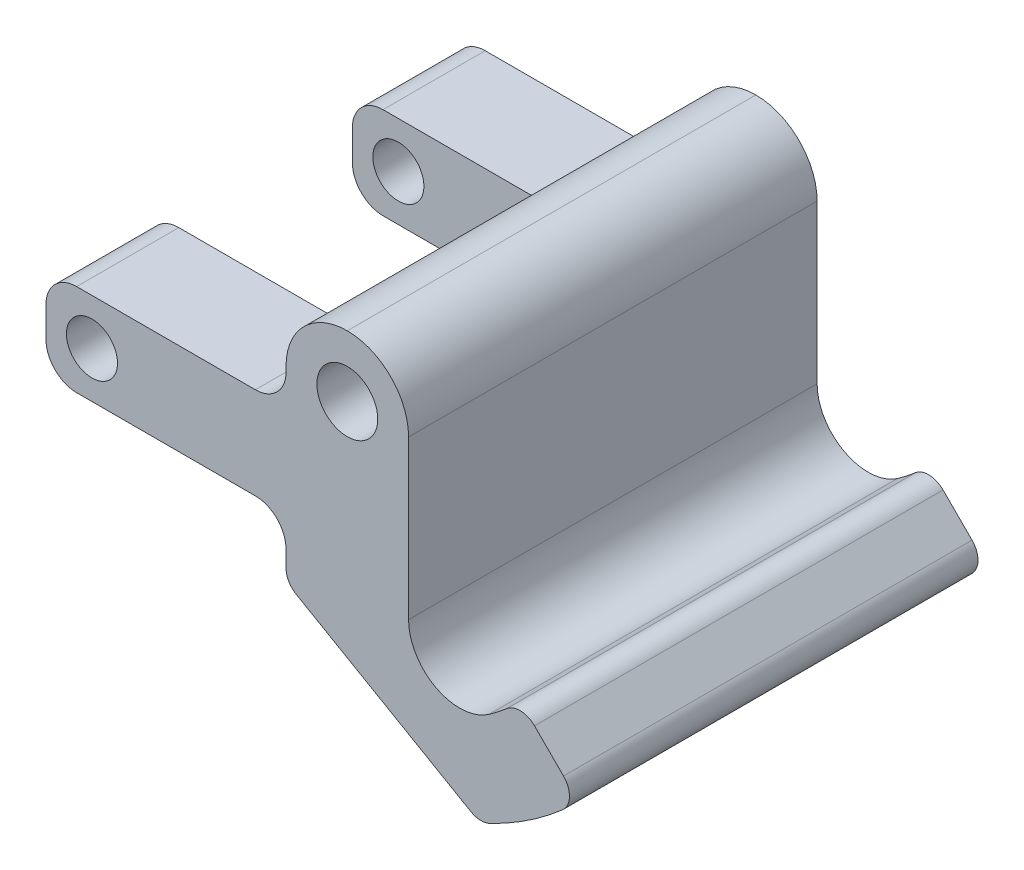
ISO-10303-21;
HEADER;
FILE_DESCRIPTION(('STEP AP214'),'2;1');
FILE_NAME('part.step','',(''),(''),'','','');
FILE_SCHEMA(('AUTOMOTIVE_DESIGN { 1 0 10303 214 1 1 1 1 }'));
ENDSEC;
DATA;
#1=APPLICATION_CONTEXT('core data for automotive mechanical design processes');
#2=APPLICATION_PROTOCOL_DEFINITION('international standard','automotive_design',2000,#1);
#3=PRODUCT_CONTEXT('',#1,'mechanical');
#4=PRODUCT('Part','Part','',(#3));
#5=PRODUCT_RELATED_PRODUCT_CATEGORY('part','',(#4));
#6=PRODUCT_DEFINITION_FORMATION('','',#4);
#7=PRODUCT_DEFINITION_CONTEXT('part definition',#1,'design');
#8=PRODUCT_DEFINITION('design','',#6,#7);
#9=PRODUCT_DEFINITION_SHAPE('','',#8);
#10=(LENGTH_UNIT() NAMED_UNIT(*) SI_UNIT(.MILLI.,.METRE.));
#11=(NAMED_UNIT(*) PLANE_ANGLE_UNIT() SI_UNIT($,.RADIAN.));
#12=(NAMED_UNIT(*) SI_UNIT($,.STERADIAN.) SOLID_ANGLE_UNIT());
#13=UNCERTAINTY_MEASURE_WITH_UNIT(LENGTH_MEASURE(1.E-05),#10,'distance_accuracy_value','');
#14=(GEOMETRIC_REPRESENTATION_CONTEXT(3) GLOBAL_UNCERTAINTY_ASSIGNED_CONTEXT((#13)) GLOBAL_UNIT_ASSIGNED_CONTEXT((#10,
#11,#12)) REPRESENTATION_CONTEXT('',''));
#15=CARTESIAN_POINT('',(0.,0.,0.));
#16=DIRECTION('',(0.,0.,1.));
#17=DIRECTION('',(1.,0.,0.));
#18=AXIS2_PLACEMENT_3D('',#15,#16,#17);
#19=CARTESIAN_POINT('',(-6.,6.,20.));
#20=DIRECTION('',(1.,0.,0.));
#21=DIRECTION('',(0.,1.,0.));
#22=AXIS2_PLACEMENT_3D('',#19,#20,#21);
#23=PLANE('',#22);
#24=DIRECTION('',(0.,1.,0.));
#25=VECTOR('',#24,1.);
#26=CARTESIAN_POINT('',(-6.,-12.5,-10.));
#27=LINE('',#26,#25);
#28=CARTESIAN_POINT('',(-6.,-15.5,-10.));
#29=VERTEX_POINT('',#28);
#30=CARTESIAN_POINT('',(-6.,-0.500000000000002,-10.));
#31=VERTEX_POINT('',#30);
#32=EDGE_CURVE('E397',#29,#31,#27,.T.);
#33=ORIENTED_EDGE('',*,*,#32,.F.);
#34=DIRECTION('',(0.,0.,-1.));
#35=VECTOR('',#34,1.);
#36=CARTESIAN_POINT('',(-6.,-15.5,-20.));
#37=LINE('',#36,#35);
#38=CARTESIAN_POINT('',(-6.,-15.5,-20.));
#39=VERTEX_POINT('',#38);
#40=EDGE_CURVE('E364',#29,#39,#37,.T.);
#41=ORIENTED_EDGE('',*,*,#40,.T.);
#42=DIRECTION('',(0.,-1.,0.));
#43=VECTOR('',#42,1.);
#44=CARTESIAN_POINT('',(-6.,6.,-20.));
#45=LINE('',#44,#43);
#46=CARTESIAN_POINT('',(-6.,-17.1160273814448,-20.));
#47=VERTEX_POINT('',#46);
#48=EDGE_CURVE('E254',#39,#47,#45,.T.);
#49=ORIENTED_EDGE('',*,*,#48,.T.);
#50=DIRECTION('',(0.,0.,-1.));
#51=VECTOR('',#50,1.);
#52=CARTESIAN_POINT('',(-6.,-17.1160273814448,20.));
#53=LINE('',#52,#51);
#54=CARTESIAN_POINT('',(-6.,-17.1160273814448,20.));
#55=VERTEX_POINT('',#54);
#56=EDGE_CURVE('E292',#47,#55,#53,.F.);
#57=ORIENTED_EDGE('',*,*,#56,.T.);
#58=DIRECTION('',(0.,-1.,0.));
#59=VECTOR('',#58,1.);
#60=CARTESIAN_POINT('',(-6.,6.,20.));
#61=LINE('',#60,#59);
#62=CARTESIAN_POINT('',(-6.,-15.5,20.));
#63=VERTEX_POINT('',#62);
#64=EDGE_CURVE('E424',#63,#55,#61,.T.);
#65=ORIENTED_EDGE('',*,*,#64,.F.);
#66=DIRECTION('',(0.,0.,1.));
#67=VECTOR('',#66,1.);
#68=CARTESIAN_POINT('',(-6.,-15.5,20.));
#69=LINE('',#68,#67);
#70=CARTESIAN_POINT('',(-6.,-15.5,10.));
#71=VERTEX_POINT('',#70);
#72=EDGE_CURVE('E332',#63,#71,#69,.F.);
#73=ORIENTED_EDGE('',*,*,#72,.T.);
#74=DIRECTION('',(0.,1.,0.));
#75=VECTOR('',#74,1.);
#76=CARTESIAN_POINT('',(-6.,-12.5,10.));
#77=LINE('',#76,#75);
#78=CARTESIAN_POINT('',(-6.,-0.500000000000002,10.));
#79=VERTEX_POINT('',#78);
#80=EDGE_CURVE('E476',#71,#79,#77,.T.);
#81=ORIENTED_EDGE('',*,*,#80,.T.);
#82=DIRECTION('',(0.,0.,1.));
#83=VECTOR('',#82,1.);
#84=CARTESIAN_POINT('',(-6.,-0.500000000000002,20.));
#85=LINE('',#84,#83);
#86=CARTESIAN_POINT('',(-6.,-0.500000000000002,20.));
#87=VERTEX_POINT('',#86);
#88=EDGE_CURVE('E330',#79,#87,#85,.T.);
#89=ORIENTED_EDGE('',*,*,#88,.T.);
#90=CARTESIAN_POINT('',(-6.,0.,20.));
#91=VERTEX_POINT('',#90);
#92=EDGE_CURVE('E238',#91,#87,#61,.T.);
#93=ORIENTED_EDGE('',*,*,#92,.F.);
#94=DIRECTION('',(0.,0.,-1.));
#95=VECTOR('',#94,1.);
#96=CARTESIAN_POINT('',(-6.,0.,20.));
#97=LINE('',#96,#95);
#98=CARTESIAN_POINT('',(-6.,0.,-20.));
#99=VERTEX_POINT('',#98);
#100=EDGE_CURVE('E231',#91,#99,#97,.T.);
#101=ORIENTED_EDGE('',*,*,#100,.T.);
#102=CARTESIAN_POINT('',(-6.,-0.500000000000002,-20.));
#103=VERTEX_POINT('',#102);
#104=EDGE_CURVE('E234',#99,#103,#45,.T.);
#105=ORIENTED_EDGE('',*,*,#104,.T.);
#106=DIRECTION('',(0.,0.,-1.));
#107=VECTOR('',#106,1.);
#108=CARTESIAN_POINT('',(-6.,-0.500000000000002,-10.));
#109=LINE('',#108,#107);
#110=EDGE_CURVE('E362',#103,#31,#109,.F.);
#111=ORIENTED_EDGE('',*,*,#110,.T.);
#112=EDGE_LOOP('',(#33,#41,#49,#57,#65,#73,#81,#89,#93,#101,#105,#111));
#113=FACE_BOUND('',#112,.T.);
#114=ADVANCED_FACE('F38',(#113),#23,.F.);
#115=CARTESIAN_POINT('',(0.,0.,20.));
#116=DIRECTION('',(0.,0.,1.));
#117=DIRECTION('',(1.,0.,0.));
#118=AXIS2_PLACEMENT_3D('',#115,#116,#117);
#119=PLANE('',#118);
#120=DIRECTION('',(0.,-1.,0.));
#121=VECTOR('',#120,1.);
#122=CARTESIAN_POINT('',(-29.5,-3.50000000000001,20.));
#123=LINE('',#122,#121);
#124=CARTESIAN_POINT('',(-29.5,-6.50000000000001,20.));
#125=VERTEX_POINT('',#124);
#126=CARTESIAN_POINT('',(-29.5,-9.50000000000001,20.));
#127=VERTEX_POINT('',#126);
#128=EDGE_CURVE('E468',#125,#127,#123,.T.);
#129=ORIENTED_EDGE('',*,*,#128,.T.);
#130=CARTESIAN_POINT('',(-26.5,-9.50000000000001,20.));
#131=DIRECTION('',(0.,0.,1.));
#132=DIRECTION('',(1.,0.,0.));
#133=AXIS2_PLACEMENT_3D('',#130,#131,#132);
#134=CIRCLE('',#133,3.);
#135=CARTESIAN_POINT('',(-26.5,-12.5,20.));
#136=VERTEX_POINT('',#135);
#137=EDGE_CURVE('E347',#127,#136,#134,.T.);
#138=ORIENTED_EDGE('',*,*,#137,.T.);
#139=DIRECTION('',(1.,0.,0.));
#140=VECTOR('',#139,1.);
#141=CARTESIAN_POINT('',(-29.5,-12.5,20.));
#142=LINE('',#141,#140);
#143=CARTESIAN_POINT('',(-9.00000000000001,-12.5,20.));
#144=VERTEX_POINT('',#143);
#145=EDGE_CURVE('E484',#136,#144,#142,.T.);
#146=ORIENTED_EDGE('',*,*,#145,.T.);
#147=CARTESIAN_POINT('',(-9.00000000000001,-15.5,20.));
#148=DIRECTION('',(0.,0.,1.));
#149=DIRECTION('',(1.,0.,0.));
#150=AXIS2_PLACEMENT_3D('',#147,#148,#149);
#151=CIRCLE('',#150,3.);
#152=EDGE_CURVE('E353',#144,#63,#151,.F.);
#153=ORIENTED_EDGE('',*,*,#152,.T.);
#154=ORIENTED_EDGE('',*,*,#64,.T.);
#155=CARTESIAN_POINT('',(-4.,-17.1160273814448,20.));
#156=DIRECTION('',(0.,0.,1.));
#157=DIRECTION('',(1.,0.,0.));
#158=AXIS2_PLACEMENT_3D('',#155,#156,#157);
#159=CIRCLE('',#158,2.);
#160=CARTESIAN_POINT('',(-5.,-18.8480781890137,20.));
#161=VERTEX_POINT('',#160);
#162=EDGE_CURVE('E301',#55,#161,#159,.T.);
#163=ORIENTED_EDGE('',*,*,#162,.T.);
#164=DIRECTION('',(0.86602540378444,-0.499999999999998,0.));
#165=VECTOR('',#164,1.);
#166=CARTESIAN_POINT('',(-6.,-18.2707279198241,20.));
#167=LINE('',#166,#165);
#168=CARTESIAN_POINT('',(12.0999852786396,-28.7207592927748,20.));
#169=VERTEX_POINT('',#168);
#170=EDGE_CURVE('E430',#161,#169,#167,.T.);
#171=ORIENTED_EDGE('',*,*,#170,.T.);
#172=CARTESIAN_POINT('',(13.0999852786395,-26.9887084852059,20.));
#173=DIRECTION('',(0.,0.,1.));
#174=DIRECTION('',(1.,0.,0.));
#175=AXIS2_PLACEMENT_3D('',#172,#173,#174);
#176=CIRCLE('',#175,2.);
#177=CARTESIAN_POINT('',(13.9733176305489,-28.787955717553,20.));
#178=VERTEX_POINT('',#177);
#179=EDGE_CURVE('E299',#169,#178,#176,.T.);
#180=ORIENTED_EDGE('',*,*,#179,.T.);
#181=CARTESIAN_POINT('',(0.,0.,20.));
#182=DIRECTION('',(0.,0.,1.));
#183=DIRECTION('',(1.,0.,0.));
#184=AXIS2_PLACEMENT_3D('',#181,#182,#183);
#185=CIRCLE('',#184,32.);
#186=CARTESIAN_POINT('',(21.0685833878864,-24.0855723209493,20.));
#187=VERTEX_POINT('',#186);
#188=EDGE_CURVE('E435',#178,#187,#185,.T.);
#189=ORIENTED_EDGE('',*,*,#188,.T.);
#190=CARTESIAN_POINT('',(19.7517969261435,-22.5802240508899,20.));
#191=DIRECTION('',(0.,0.,1.));
#192=DIRECTION('',(1.,0.,0.));
#193=AXIS2_PLACEMENT_3D('',#190,#191,#192);
#194=CIRCLE('',#193,2.);
#195=CARTESIAN_POINT('',(21.1660104885166,-21.1660104885168,20.));
#196=VERTEX_POINT('',#195);
#197=EDGE_CURVE('E297',#187,#196,#194,.T.);
#198=ORIENTED_EDGE('',*,*,#197,.T.);
#199=DIRECTION('',(-0.707106781186544,0.707106781186551,0.));
#200=VECTOR('',#199,1.);
#201=CARTESIAN_POINT('',(16.9705627484771,-16.9705627484772,20.));
#202=LINE('',#201,#200);
#203=CARTESIAN_POINT('',(18.3303027798233,-18.3303027798235,20.));
#204=VERTEX_POINT('',#203);
#205=EDGE_CURVE('E438',#196,#204,#202,.T.);
#206=ORIENTED_EDGE('',*,*,#205,.T.);
#207=CARTESIAN_POINT('',(16.9160892174502,-19.7445163421965,20.));
#208=DIRECTION('',(0.,0.,1.));
#209=DIRECTION('',(1.,0.,0.));
#210=AXIS2_PLACEMENT_3D('',#207,#208,#209);
#211=CIRCLE('',#210,2.);
#212=CARTESIAN_POINT('',(15.6148515853386,-18.2257073927968,20.));
#213=VERTEX_POINT('',#212);
#214=EDGE_CURVE('E295',#204,#213,#211,.T.);
#215=ORIENTED_EDGE('',*,*,#214,.T.);
#216=CARTESIAN_POINT('',(0.,0.,20.));
#217=DIRECTION('',(0.,0.,-1.));
#218=DIRECTION('',(1.,0.,0.));
#219=AXIS2_PLACEMENT_3D('',#216,#217,#218);
#220=CIRCLE('',#219,24.);
#221=CARTESIAN_POINT('',(13.8947368421053,-19.5687579597848,20.));
#222=VERTEX_POINT('',#221);
#223=EDGE_CURVE('E265',#213,#222,#220,.T.);
#224=ORIENTED_EDGE('',*,*,#223,.T.);
#225=CARTESIAN_POINT('',(11.,-15.4919333848297,20.));
#226=DIRECTION('',(0.,0.,1.));
#227=DIRECTION('',(1.,0.,0.));
#228=AXIS2_PLACEMENT_3D('',#225,#226,#227);
#229=CIRCLE('',#228,5.);
#230=CARTESIAN_POINT('',(6.,-15.4919333848297,20.));
#231=VERTEX_POINT('',#230);
#232=EDGE_CURVE('E323',#222,#231,#229,.F.);
#233=ORIENTED_EDGE('',*,*,#232,.T.);
#234=DIRECTION('',(0.,1.,0.));
#235=VECTOR('',#234,1.);
#236=CARTESIAN_POINT('',(6.,6.,20.));
#237=LINE('',#236,#235);
#238=CARTESIAN_POINT('',(6.,0.,20.));
#239=VERTEX_POINT('',#238);
#240=EDGE_CURVE('E261',#231,#239,#237,.T.);
#241=ORIENTED_EDGE('',*,*,#240,.T.);
#242=CARTESIAN_POINT('',(0.,0.,20.));
#243=DIRECTION('',(0.,0.,1.));
#244=DIRECTION('',(1.,0.,0.));
#245=AXIS2_PLACEMENT_3D('',#242,#243,#244);
#246=CIRCLE('',#245,6.);
#247=CARTESIAN_POINT('',(0.,6.,20.));
#248=VERTEX_POINT('',#247);
#249=EDGE_CURVE('E243',#239,#248,#246,.T.);
#250=ORIENTED_EDGE('',*,*,#249,.T.);
#251=CARTESIAN_POINT('',(0.,0.,20.));
#252=DIRECTION('',(0.,0.,1.));
#253=DIRECTION('',(1.,0.,0.));
#254=AXIS2_PLACEMENT_3D('',#251,#252,#253);
#255=CIRCLE('',#254,6.);
#256=EDGE_CURVE('E273',#248,#91,#255,.T.);
#257=ORIENTED_EDGE('',*,*,#256,.T.);
#258=ORIENTED_EDGE('',*,*,#92,.T.);
#259=CARTESIAN_POINT('',(-9.,-0.500000000000002,20.));
#260=DIRECTION('',(0.,0.,1.));
#261=DIRECTION('',(1.,0.,0.));
#262=AXIS2_PLACEMENT_3D('',#259,#260,#261);
#263=CIRCLE('',#262,3.);
#264=CARTESIAN_POINT('',(-9.,-3.5,20.));
#265=VERTEX_POINT('',#264);
#266=EDGE_CURVE('E357',#87,#265,#263,.F.);
#267=ORIENTED_EDGE('',*,*,#266,.T.);
#268=DIRECTION('',(-1.,0.,0.));
#269=VECTOR('',#268,1.);
#270=CARTESIAN_POINT('',(-6.,-3.5,20.));
#271=LINE('',#270,#269);
#272=CARTESIAN_POINT('',(-26.5,-3.50000000000001,20.));
#273=VERTEX_POINT('',#272);
#274=EDGE_CURVE('E459',#265,#273,#271,.T.);
#275=ORIENTED_EDGE('',*,*,#274,.T.);
#276=CARTESIAN_POINT('',(-26.5,-6.50000000000001,20.));
#277=DIRECTION('',(0.,0.,1.));
#278=DIRECTION('',(1.,0.,0.));
#279=AXIS2_PLACEMENT_3D('',#276,#277,#278);
#280=CIRCLE('',#279,3.);
#281=EDGE_CURVE('E345',#273,#125,#280,.T.);
#282=ORIENTED_EDGE('',*,*,#281,.T.);
#283=EDGE_LOOP('',(#129,#138,#146,#153,#154,#163,#171,#180,#189,#198,#206,#215,#224,#233,#241,
#250,#257,#258,#267,#275,#282));
#284=FACE_BOUND('',#283,.T.);
#285=CARTESIAN_POINT('',(0.,0.,20.));
#286=DIRECTION('',(0.,0.,1.));
#287=DIRECTION('',(1.,0.,0.));
#288=AXIS2_PLACEMENT_3D('',#285,#286,#287);
#289=CIRCLE('',#288,2.98);
#290=CARTESIAN_POINT('',(2.98,0.,20.));
#291=VERTEX_POINT('',#290);
#292=EDGE_CURVE('E407',#291,#291,#289,.T.);
#293=ORIENTED_EDGE('',*,*,#292,.F.);
#294=EDGE_LOOP('',(#293));
#295=FACE_BOUND('',#294,.T.);
#296=CARTESIAN_POINT('',(-25.,-8.00000000000001,20.));
#297=DIRECTION('',(0.,0.,1.));
#298=DIRECTION('',(1.,0.,0.));
#299=AXIS2_PLACEMENT_3D('',#296,#297,#298);
#300=CIRCLE('',#299,2.5);
#301=CARTESIAN_POINT('',(-22.5,-8.00000000000001,20.));
#302=VERTEX_POINT('',#301);
#303=EDGE_CURVE('E700',#302,#302,#300,.T.);
#304=ORIENTED_EDGE('',*,*,#303,.F.);
#305=EDGE_LOOP('',(#304));
#306=FACE_BOUND('',#305,.T.);
#307=ADVANCED_FACE('F444',(#284,#295,#306),#119,.T.);
#308=CARTESIAN_POINT('',(0.,0.,-20.));
#309=DIRECTION('',(0.,0.,1.));
#310=DIRECTION('',(1.,0.,0.));
#311=AXIS2_PLACEMENT_3D('',#308,#309,#310);
#312=PLANE('',#311);
#313=DIRECTION('',(1.,0.,0.));
#314=VECTOR('',#313,1.);
#315=CARTESIAN_POINT('',(-29.5,-12.5,-20.));
#316=LINE('',#315,#314);
#317=CARTESIAN_POINT('',(-26.5,-12.5,-20.));
#318=VERTEX_POINT('',#317);
#319=CARTESIAN_POINT('',(-9.,-12.5,-20.));
#320=VERTEX_POINT('',#319);
#321=EDGE_CURVE('E692',#318,#320,#316,.T.);
#322=ORIENTED_EDGE('',*,*,#321,.F.);
#323=CARTESIAN_POINT('',(-26.5,-9.50000000000001,-20.));
#324=DIRECTION('',(0.,0.,1.));
#325=DIRECTION('',(1.,0.,0.));
#326=AXIS2_PLACEMENT_3D('',#323,#324,#325);
#327=CIRCLE('',#326,3.);
#328=CARTESIAN_POINT('',(-29.5,-9.50000000000001,-20.));
#329=VERTEX_POINT('',#328);
#330=EDGE_CURVE('E379',#318,#329,#327,.F.);
#331=ORIENTED_EDGE('',*,*,#330,.T.);
#332=DIRECTION('',(0.,-1.,0.));
#333=VECTOR('',#332,1.);
#334=CARTESIAN_POINT('',(-29.5,-3.50000000000001,-20.));
#335=LINE('',#334,#333);
#336=CARTESIAN_POINT('',(-29.5,-6.50000000000001,-20.));
#337=VERTEX_POINT('',#336);
#338=EDGE_CURVE('E688',#337,#329,#335,.T.);
#339=ORIENTED_EDGE('',*,*,#338,.F.);
#340=CARTESIAN_POINT('',(-26.5,-6.50000000000001,-20.));
#341=DIRECTION('',(0.,0.,1.));
#342=DIRECTION('',(1.,0.,0.));
#343=AXIS2_PLACEMENT_3D('',#340,#341,#342);
#344=CIRCLE('',#343,3.);
#345=CARTESIAN_POINT('',(-26.5,-3.50000000000001,-20.));
#346=VERTEX_POINT('',#345);
#347=EDGE_CURVE('E377',#337,#346,#344,.F.);
#348=ORIENTED_EDGE('',*,*,#347,.T.);
#349=DIRECTION('',(-1.,0.,0.));
#350=VECTOR('',#349,1.);
#351=CARTESIAN_POINT('',(-6.,-3.5,-20.));
#352=LINE('',#351,#350);
#353=CARTESIAN_POINT('',(-9.,-3.5,-20.));
#354=VERTEX_POINT('',#353);
#355=EDGE_CURVE('E691',#354,#346,#352,.T.);
#356=ORIENTED_EDGE('',*,*,#355,.F.);
#357=CARTESIAN_POINT('',(-9.,-0.500000000000002,-20.));
#358=DIRECTION('',(0.,0.,1.));
#359=DIRECTION('',(1.,0.,0.));
#360=AXIS2_PLACEMENT_3D('',#357,#358,#359);
#361=CIRCLE('',#360,3.);
#362=EDGE_CURVE('E46',#354,#103,#361,.T.);
#363=ORIENTED_EDGE('',*,*,#362,.T.);
#364=ORIENTED_EDGE('',*,*,#104,.F.);
#365=CARTESIAN_POINT('',(0.,0.,-20.));
#366=DIRECTION('',(0.,0.,1.));
#367=DIRECTION('',(1.,0.,0.));
#368=AXIS2_PLACEMENT_3D('',#365,#366,#367);
#369=CIRCLE('',#368,6.);
#370=CARTESIAN_POINT('',(0.,6.,-20.));
#371=VERTEX_POINT('',#370);
#372=EDGE_CURVE('E250',#99,#371,#369,.F.);
#373=ORIENTED_EDGE('',*,*,#372,.T.);
#374=CARTESIAN_POINT('',(0.,0.,-20.));
#375=DIRECTION('',(0.,0.,1.));
#376=DIRECTION('',(1.,0.,0.));
#377=AXIS2_PLACEMENT_3D('',#374,#375,#376);
#378=CIRCLE('',#377,6.);
#379=CARTESIAN_POINT('',(6.,0.,-20.));
#380=VERTEX_POINT('',#379);
#381=EDGE_CURVE('E260',#371,#380,#378,.F.);
#382=ORIENTED_EDGE('',*,*,#381,.T.);
#383=DIRECTION('',(0.,1.,0.));
#384=VECTOR('',#383,1.);
#385=CARTESIAN_POINT('',(6.,6.,-20.));
#386=LINE('',#385,#384);
#387=CARTESIAN_POINT('',(6.,-15.4919333848297,-20.));
#388=VERTEX_POINT('',#387);
#389=EDGE_CURVE('E268',#388,#380,#386,.T.);
#390=ORIENTED_EDGE('',*,*,#389,.F.);
#391=CARTESIAN_POINT('',(11.,-15.4919333848297,-20.));
#392=DIRECTION('',(0.,0.,1.));
#393=DIRECTION('',(1.,0.,0.));
#394=AXIS2_PLACEMENT_3D('',#391,#392,#393);
#395=CIRCLE('',#394,5.);
#396=CARTESIAN_POINT('',(13.8947368421053,-19.5687579597848,-20.));
#397=VERTEX_POINT('',#396);
#398=EDGE_CURVE('E321',#388,#397,#395,.T.);
#399=ORIENTED_EDGE('',*,*,#398,.T.);
#400=CARTESIAN_POINT('',(0.,0.,-20.));
#401=DIRECTION('',(0.,0.,-1.));
#402=DIRECTION('',(1.,0.,0.));
#403=AXIS2_PLACEMENT_3D('',#400,#401,#402);
#404=CIRCLE('',#403,24.);
#405=CARTESIAN_POINT('',(15.6148515853386,-18.2257073927968,-20.));
#406=VERTEX_POINT('',#405);
#407=EDGE_CURVE('E419',#406,#397,#404,.T.);
#408=ORIENTED_EDGE('',*,*,#407,.F.);
#409=CARTESIAN_POINT('',(16.9160892174502,-19.7445163421965,-20.));
#410=DIRECTION('',(0.,0.,1.));
#411=DIRECTION('',(1.,0.,0.));
#412=AXIS2_PLACEMENT_3D('',#409,#410,#411);
#413=CIRCLE('',#412,2.);
#414=CARTESIAN_POINT('',(18.3303027798233,-18.3303027798235,-20.));
#415=VERTEX_POINT('',#414);
#416=EDGE_CURVE('E283',#406,#415,#413,.F.);
#417=ORIENTED_EDGE('',*,*,#416,.T.);
#418=DIRECTION('',(-0.707106781186544,0.707106781186551,0.));
#419=VECTOR('',#418,1.);
#420=CARTESIAN_POINT('',(16.9705627484771,-16.9705627484772,-20.));
#421=LINE('',#420,#419);
#422=CARTESIAN_POINT('',(21.1660104885166,-21.1660104885168,-20.));
#423=VERTEX_POINT('',#422);
#424=EDGE_CURVE('E417',#423,#415,#421,.T.);
#425=ORIENTED_EDGE('',*,*,#424,.F.);
#426=CARTESIAN_POINT('',(19.7517969261435,-22.5802240508899,-20.));
#427=DIRECTION('',(0.,0.,1.));
#428=DIRECTION('',(1.,0.,0.));
#429=AXIS2_PLACEMENT_3D('',#426,#427,#428);
#430=CIRCLE('',#429,2.);
#431=CARTESIAN_POINT('',(21.0685833878864,-24.0855723209493,-20.));
#432=VERTEX_POINT('',#431);
#433=EDGE_CURVE('E285',#423,#432,#430,.F.);
#434=ORIENTED_EDGE('',*,*,#433,.T.);
#435=CARTESIAN_POINT('',(0.,0.,-20.));
#436=DIRECTION('',(0.,0.,1.));
#437=DIRECTION('',(1.,0.,0.));
#438=AXIS2_PLACEMENT_3D('',#435,#436,#437);
#439=CIRCLE('',#438,32.);
#440=CARTESIAN_POINT('',(13.9733176305489,-28.787955717553,-20.));
#441=VERTEX_POINT('',#440);
#442=EDGE_CURVE('E414',#441,#432,#439,.T.);
#443=ORIENTED_EDGE('',*,*,#442,.F.);
#444=CARTESIAN_POINT('',(13.0999852786395,-26.9887084852059,-20.));
#445=DIRECTION('',(0.,0.,1.));
#446=DIRECTION('',(1.,0.,0.));
#447=AXIS2_PLACEMENT_3D('',#444,#445,#446);
#448=CIRCLE('',#447,2.);
#449=CARTESIAN_POINT('',(12.0999852786396,-28.7207592927748,-20.));
#450=VERTEX_POINT('',#449);
#451=EDGE_CURVE('E287',#441,#450,#448,.F.);
#452=ORIENTED_EDGE('',*,*,#451,.T.);
#453=DIRECTION('',(0.86602540378444,-0.499999999999998,0.));
#454=VECTOR('',#453,1.);
#455=CARTESIAN_POINT('',(-6.,-18.2707279198241,-20.));
#456=LINE('',#455,#454);
#457=CARTESIAN_POINT('',(-5.,-18.8480781890137,-20.));
#458=VERTEX_POINT('',#457);
#459=EDGE_CURVE('E253',#458,#450,#456,.T.);
#460=ORIENTED_EDGE('',*,*,#459,.F.);
#461=CARTESIAN_POINT('',(-4.,-17.1160273814448,-20.));
#462=DIRECTION('',(0.,0.,1.));
#463=DIRECTION('',(1.,0.,0.));
#464=AXIS2_PLACEMENT_3D('',#461,#462,#463);
#465=CIRCLE('',#464,2.);
#466=EDGE_CURVE('E289',#458,#47,#465,.F.);
#467=ORIENTED_EDGE('',*,*,#466,.T.);
#468=ORIENTED_EDGE('',*,*,#48,.F.);
#469=CARTESIAN_POINT('',(-9.,-15.5,-20.));
#470=DIRECTION('',(0.,0.,1.));
#471=DIRECTION('',(1.,0.,0.));
#472=AXIS2_PLACEMENT_3D('',#469,#470,#471);
#473=CIRCLE('',#472,3.);
#474=EDGE_CURVE('E388',#39,#320,#473,.T.);
#475=ORIENTED_EDGE('',*,*,#474,.T.);
#476=EDGE_LOOP('',(#322,#331,#339,#348,#356,#363,#364,#373,#382,#390,#399,#408,#417,#425,#434,
#443,#452,#460,#467,#468,#475));
#477=FACE_BOUND('',#476,.T.);
#478=CARTESIAN_POINT('',(0.,0.,-20.));
#479=DIRECTION('',(0.,0.,1.));
#480=DIRECTION('',(1.,0.,0.));
#481=AXIS2_PLACEMENT_3D('',#478,#479,#480);
#482=CIRCLE('',#481,2.98);
#483=CARTESIAN_POINT('',(2.98,0.,-20.));
#484=VERTEX_POINT('',#483);
#485=EDGE_CURVE('E277',#484,#484,#482,.T.);
#486=ORIENTED_EDGE('',*,*,#485,.T.);
#487=EDGE_LOOP('',(#486));
#488=FACE_BOUND('',#487,.T.);
#489=CARTESIAN_POINT('',(-25.,-8.00000000000001,-20.));
#490=DIRECTION('',(0.,0.,1.));
#491=DIRECTION('',(1.,0.,0.));
#492=AXIS2_PLACEMENT_3D('',#489,#490,#491);
#493=CIRCLE('',#492,2.5);
#494=CARTESIAN_POINT('',(-22.5,-8.00000000000001,-20.));
#495=VERTEX_POINT('',#494);
#496=EDGE_CURVE('E710',#495,#495,#493,.T.);
#497=ORIENTED_EDGE('',*,*,#496,.T.);
#498=EDGE_LOOP('',(#497));
#499=FACE_BOUND('',#498,.T.);
#500=ADVANCED_FACE('F247',(#477,#488,#499),#312,.F.);
#501=CARTESIAN_POINT('',(-6.,-18.2707279198241,20.));
#502=DIRECTION('',(0.499999999999998,0.86602540378444,0.));
#503=DIRECTION('',(-0.86602540378444,0.499999999999998,0.));
#504=AXIS2_PLACEMENT_3D('',#501,#502,#503);
#505=PLANE('',#504);
#506=ORIENTED_EDGE('',*,*,#170,.F.);
#507=DIRECTION('',(0.,0.,-1.));
#508=VECTOR('',#507,1.);
#509=CARTESIAN_POINT('',(-5.,-18.8480781890137,20.));
#510=LINE('',#509,#508);
#511=EDGE_CURVE('E280',#161,#458,#510,.T.);
#512=ORIENTED_EDGE('',*,*,#511,.T.);
#513=ORIENTED_EDGE('',*,*,#459,.T.);
#514=DIRECTION('',(0.,0.,-1.));
#515=VECTOR('',#514,1.);
#516=CARTESIAN_POINT('',(12.0999852786396,-28.7207592927748,20.));
#517=LINE('',#516,#515);
#518=EDGE_CURVE('E242',#450,#169,#517,.F.);
#519=ORIENTED_EDGE('',*,*,#518,.T.);
#520=EDGE_LOOP('',(#506,#512,#513,#519));
#521=FACE_BOUND('',#520,.T.);
#522=ADVANCED_FACE('F525',(#521),#505,.F.);
#523=CARTESIAN_POINT('',(0.,0.,20.));
#524=DIRECTION('',(0.,0.,-1.));
#525=DIRECTION('',(-1.,0.,0.));
#526=AXIS2_PLACEMENT_3D('',#523,#524,#525);
#527=CYLINDRICAL_SURFACE('',#526,32.);
#528=ORIENTED_EDGE('',*,*,#188,.F.);
#529=DIRECTION('',(0.,0.,-1.));
#530=VECTOR('',#529,1.);
#531=CARTESIAN_POINT('',(13.9733176305489,-28.787955717553,20.));
#532=LINE('',#531,#530);
#533=EDGE_CURVE('E305',#178,#441,#532,.T.);
#534=ORIENTED_EDGE('',*,*,#533,.T.);
#535=ORIENTED_EDGE('',*,*,#442,.T.);
#536=DIRECTION('',(0.,0.,-1.));
#537=VECTOR('',#536,1.);
#538=CARTESIAN_POINT('',(21.0685833878864,-24.0855723209493,20.));
#539=LINE('',#538,#537);
#540=EDGE_CURVE('E303',#432,#187,#539,.F.);
#541=ORIENTED_EDGE('',*,*,#540,.T.);
#542=EDGE_LOOP('',(#528,#534,#535,#541));
#543=FACE_BOUND('',#542,.T.);
#544=ADVANCED_FACE('F748',(#543),#527,.T.);
#545=CARTESIAN_POINT('',(16.9705627484771,-16.9705627484772,20.));
#546=DIRECTION('',(-0.707106781186551,-0.707106781186544,0.));
#547=DIRECTION('',(0.707106781186544,-0.707106781186551,0.));
#548=AXIS2_PLACEMENT_3D('',#545,#546,#547);
#549=PLANE('',#548);
#550=ORIENTED_EDGE('',*,*,#205,.F.);
#551=DIRECTION('',(0.,0.,-1.));
#552=VECTOR('',#551,1.);
#553=CARTESIAN_POINT('',(21.1660104885166,-21.1660104885168,20.));
#554=LINE('',#553,#552);
#555=EDGE_CURVE('E310',#196,#423,#554,.T.);
#556=ORIENTED_EDGE('',*,*,#555,.T.);
#557=ORIENTED_EDGE('',*,*,#424,.T.);
#558=DIRECTION('',(0.,0.,-1.));
#559=VECTOR('',#558,1.);
#560=CARTESIAN_POINT('',(18.3303027798233,-18.3303027798235,20.));
#561=LINE('',#560,#559);
#562=EDGE_CURVE('E308',#415,#204,#561,.F.);
#563=ORIENTED_EDGE('',*,*,#562,.T.);
#564=EDGE_LOOP('',(#550,#556,#557,#563));
#565=FACE_BOUND('',#564,.T.);
#566=ADVANCED_FACE('F746',(#565),#549,.F.);
#567=CARTESIAN_POINT('',(0.,0.,20.));
#568=DIRECTION('',(0.,0.,-1.));
#569=DIRECTION('',(-1.,0.,0.));
#570=AXIS2_PLACEMENT_3D('',#567,#568,#569);
#571=CYLINDRICAL_SURFACE('',#570,24.);
#572=ORIENTED_EDGE('',*,*,#407,.T.);
#573=DIRECTION('',(0.,0.,-1.));
#574=VECTOR('',#573,1.);
#575=CARTESIAN_POINT('',(13.8947368421053,-19.5687579597848,20.));
#576=LINE('',#575,#574);
#577=EDGE_CURVE('E319',#397,#222,#576,.F.);
#578=ORIENTED_EDGE('',*,*,#577,.T.);
#579=ORIENTED_EDGE('',*,*,#223,.F.);
#580=DIRECTION('',(0.,0.,-1.));
#581=VECTOR('',#580,1.);
#582=CARTESIAN_POINT('',(15.6148515853386,-18.2257073927968,20.));
#583=LINE('',#582,#581);
#584=EDGE_CURVE('E313',#213,#406,#583,.T.);
#585=ORIENTED_EDGE('',*,*,#584,.T.);
#586=EDGE_LOOP('',(#572,#578,#579,#585));
#587=FACE_BOUND('',#586,.T.);
#588=ADVANCED_FACE('F743',(#587),#571,.F.);
#589=CARTESIAN_POINT('',(6.,6.,20.));
#590=DIRECTION('',(-1.,0.,0.));
#591=DIRECTION('',(0.,-1.,0.));
#592=AXIS2_PLACEMENT_3D('',#589,#590,#591);
#593=PLANE('',#592);
#594=ORIENTED_EDGE('',*,*,#240,.F.);
#595=DIRECTION('',(0.,0.,1.));
#596=VECTOR('',#595,1.);
#597=CARTESIAN_POINT('',(6.,-15.4919333848297,-20.));
#598=LINE('',#597,#596);
#599=EDGE_CURVE('E316',#231,#388,#598,.F.);
#600=ORIENTED_EDGE('',*,*,#599,.T.);
#601=ORIENTED_EDGE('',*,*,#389,.T.);
#602=DIRECTION('',(0.,0.,-1.));
#603=VECTOR('',#602,1.);
#604=CARTESIAN_POINT('',(6.,0.,20.));
#605=LINE('',#604,#603);
#606=EDGE_CURVE('E263',#380,#239,#605,.F.);
#607=ORIENTED_EDGE('',*,*,#606,.T.);
#608=EDGE_LOOP('',(#594,#600,#601,#607));
#609=FACE_BOUND('',#608,.T.);
#610=ADVANCED_FACE('F452',(#609),#593,.F.);
#611=CARTESIAN_POINT('',(0.,0.,20.));
#612=DIRECTION('',(0.,0.,-1.));
#613=DIRECTION('',(-1.,0.,0.));
#614=AXIS2_PLACEMENT_3D('',#611,#612,#613);
#615=CYLINDRICAL_SURFACE('',#614,2.98);
#616=ORIENTED_EDGE('',*,*,#292,.T.);
#617=EDGE_LOOP('',(#616));
#618=FACE_BOUND('',#617,.T.);
#619=ORIENTED_EDGE('',*,*,#485,.F.);
#620=EDGE_LOOP('',(#619));
#621=FACE_BOUND('',#620,.T.);
#622=ADVANCED_FACE('F532',(#618,#621),#615,.F.);
#623=CARTESIAN_POINT('',(0.,0.,20.));
#624=DIRECTION('',(0.,0.,-1.));
#625=DIRECTION('',(-1.,0.,0.));
#626=AXIS2_PLACEMENT_3D('',#623,#624,#625);
#627=CYLINDRICAL_SURFACE('',#626,6.);
#628=ORIENTED_EDGE('',*,*,#100,.F.);
#629=ORIENTED_EDGE('',*,*,#256,.F.);
#630=DIRECTION('',(0.,0.,-1.));
#631=VECTOR('',#630,1.);
#632=CARTESIAN_POINT('',(0.,6.,20.));
#633=LINE('',#632,#631);
#634=EDGE_CURVE('E258',#371,#248,#633,.F.);
#635=ORIENTED_EDGE('',*,*,#634,.F.);
#636=ORIENTED_EDGE('',*,*,#372,.F.);
#637=EDGE_LOOP('',(#628,#629,#635,#636));
#638=FACE_BOUND('',#637,.T.);
#639=ADVANCED_FACE('F256',(#638),#627,.T.);
#640=CARTESIAN_POINT('',(0.,0.,20.));
#641=DIRECTION('',(0.,0.,-1.));
#642=DIRECTION('',(-1.,0.,0.));
#643=AXIS2_PLACEMENT_3D('',#640,#641,#642);
#644=CYLINDRICAL_SURFACE('',#643,6.);
#645=ORIENTED_EDGE('',*,*,#249,.F.);
#646=ORIENTED_EDGE('',*,*,#606,.F.);
#647=ORIENTED_EDGE('',*,*,#381,.F.);
#648=ORIENTED_EDGE('',*,*,#634,.T.);
#649=EDGE_LOOP('',(#645,#646,#647,#648));
#650=FACE_BOUND('',#649,.T.);
#651=ADVANCED_FACE('F456',(#650),#644,.T.);
#652=CARTESIAN_POINT('',(-4.,-17.1160273814448,20.));
#653=DIRECTION('',(0.,0.,-1.));
#654=DIRECTION('',(-1.,0.,0.));
#655=AXIS2_PLACEMENT_3D('',#652,#653,#654);
#656=CYLINDRICAL_SURFACE('',#655,2.);
#657=ORIENTED_EDGE('',*,*,#162,.F.);
#658=ORIENTED_EDGE('',*,*,#56,.F.);
#659=ORIENTED_EDGE('',*,*,#466,.F.);
#660=ORIENTED_EDGE('',*,*,#511,.F.);
#661=EDGE_LOOP('',(#657,#658,#659,#660));
#662=FACE_BOUND('',#661,.T.);
#663=ADVANCED_FACE('F529',(#662),#656,.T.);
#664=CARTESIAN_POINT('',(13.0999852786395,-26.9887084852059,20.));
#665=DIRECTION('',(0.,0.,-1.));
#666=DIRECTION('',(-1.,0.,0.));
#667=AXIS2_PLACEMENT_3D('',#664,#665,#666);
#668=CYLINDRICAL_SURFACE('',#667,2.);
#669=ORIENTED_EDGE('',*,*,#179,.F.);
#670=ORIENTED_EDGE('',*,*,#518,.F.);
#671=ORIENTED_EDGE('',*,*,#451,.F.);
#672=ORIENTED_EDGE('',*,*,#533,.F.);
#673=EDGE_LOOP('',(#669,#670,#671,#672));
#674=FACE_BOUND('',#673,.T.);
#675=ADVANCED_FACE('F535',(#674),#668,.T.);
#676=CARTESIAN_POINT('',(19.7517969261435,-22.5802240508899,20.));
#677=DIRECTION('',(0.,0.,-1.));
#678=DIRECTION('',(-1.,0.,0.));
#679=AXIS2_PLACEMENT_3D('',#676,#677,#678);
#680=CYLINDRICAL_SURFACE('',#679,2.);
#681=ORIENTED_EDGE('',*,*,#197,.F.);
#682=ORIENTED_EDGE('',*,*,#540,.F.);
#683=ORIENTED_EDGE('',*,*,#433,.F.);
#684=ORIENTED_EDGE('',*,*,#555,.F.);
#685=EDGE_LOOP('',(#681,#682,#683,#684));
#686=FACE_BOUND('',#685,.T.);
#687=ADVANCED_FACE('F539',(#686),#680,.T.);
#688=CARTESIAN_POINT('',(16.9160892174502,-19.7445163421965,20.));
#689=DIRECTION('',(0.,0.,-1.));
#690=DIRECTION('',(-1.,0.,0.));
#691=AXIS2_PLACEMENT_3D('',#688,#689,#690);
#692=CYLINDRICAL_SURFACE('',#691,2.);
#693=ORIENTED_EDGE('',*,*,#214,.F.);
#694=ORIENTED_EDGE('',*,*,#562,.F.);
#695=ORIENTED_EDGE('',*,*,#416,.F.);
#696=ORIENTED_EDGE('',*,*,#584,.F.);
#697=EDGE_LOOP('',(#693,#694,#695,#696));
#698=FACE_BOUND('',#697,.T.);
#699=ADVANCED_FACE('F543',(#698),#692,.T.);
#700=CARTESIAN_POINT('',(11.,-15.4919333848297,20.));
#701=DIRECTION('',(0.,0.,-1.));
#702=DIRECTION('',(-1.,0.,0.));
#703=AXIS2_PLACEMENT_3D('',#700,#701,#702);
#704=CYLINDRICAL_SURFACE('',#703,5.);
#705=ORIENTED_EDGE('',*,*,#232,.F.);
#706=ORIENTED_EDGE('',*,*,#577,.F.);
#707=ORIENTED_EDGE('',*,*,#398,.F.);
#708=ORIENTED_EDGE('',*,*,#599,.F.);
#709=EDGE_LOOP('',(#705,#706,#707,#708));
#710=FACE_BOUND('',#709,.T.);
#711=ADVANCED_FACE('F451',(#710),#704,.F.);
#712=CARTESIAN_POINT('',(-29.5,-12.5,10.));
#713=DIRECTION('',(0.,-1.,0.));
#714=DIRECTION('',(1.,0.,0.));
#715=AXIS2_PLACEMENT_3D('',#712,#713,#714);
#716=PLANE('',#715);
#717=DIRECTION('',(1.,0.,0.));
#718=VECTOR('',#717,1.);
#719=CARTESIAN_POINT('',(-29.5,-12.5,10.));
#720=LINE('',#719,#718);
#721=CARTESIAN_POINT('',(-26.5,-12.5,10.));
#722=VERTEX_POINT('',#721);
#723=CARTESIAN_POINT('',(-9.00000000000001,-12.5,10.));
#724=VERTEX_POINT('',#723);
#725=EDGE_CURVE('E278',#722,#724,#720,.T.);
#726=ORIENTED_EDGE('',*,*,#725,.T.);
#727=DIRECTION('',(0.,0.,1.));
#728=VECTOR('',#727,1.);
#729=CARTESIAN_POINT('',(-9.00000000000001,-12.5,10.));
#730=LINE('',#729,#728);
#731=EDGE_CURVE('E327',#724,#144,#730,.T.);
#732=ORIENTED_EDGE('',*,*,#731,.T.);
#733=ORIENTED_EDGE('',*,*,#145,.F.);
#734=DIRECTION('',(0.,0.,1.));
#735=VECTOR('',#734,1.);
#736=CARTESIAN_POINT('',(-26.5,-12.5,10.));
#737=LINE('',#736,#735);
#738=EDGE_CURVE('E325',#136,#722,#737,.F.);
#739=ORIENTED_EDGE('',*,*,#738,.T.);
#740=EDGE_LOOP('',(#726,#732,#733,#739));
#741=FACE_BOUND('',#740,.T.);
#742=ADVANCED_FACE('F495',(#741),#716,.T.);
#743=CARTESIAN_POINT('',(-29.5,-3.50000000000001,10.));
#744=DIRECTION('',(-1.,0.,0.));
#745=DIRECTION('',(0.,0.,1.));
#746=AXIS2_PLACEMENT_3D('',#743,#744,#745);
#747=PLANE('',#746);
#748=DIRECTION('',(0.,-1.,0.));
#749=VECTOR('',#748,1.);
#750=CARTESIAN_POINT('',(-29.5,-3.50000000000001,10.));
#751=LINE('',#750,#749);
#752=CARTESIAN_POINT('',(-29.5,-6.50000000000001,10.));
#753=VERTEX_POINT('',#752);
#754=CARTESIAN_POINT('',(-29.5,-9.50000000000001,10.));
#755=VERTEX_POINT('',#754);
#756=EDGE_CURVE('E480',#753,#755,#751,.T.);
#757=ORIENTED_EDGE('',*,*,#756,.T.);
#758=DIRECTION('',(0.,0.,1.));
#759=VECTOR('',#758,1.);
#760=CARTESIAN_POINT('',(-29.5,-9.50000000000001,10.));
#761=LINE('',#760,#759);
#762=EDGE_CURVE('E342',#755,#127,#761,.T.);
#763=ORIENTED_EDGE('',*,*,#762,.T.);
#764=ORIENTED_EDGE('',*,*,#128,.F.);
#765=DIRECTION('',(0.,0.,1.));
#766=VECTOR('',#765,1.);
#767=CARTESIAN_POINT('',(-29.5,-6.50000000000001,10.));
#768=LINE('',#767,#766);
#769=EDGE_CURVE('E340',#125,#753,#768,.F.);
#770=ORIENTED_EDGE('',*,*,#769,.T.);
#771=EDGE_LOOP('',(#757,#763,#764,#770));
#772=FACE_BOUND('',#771,.T.);
#773=ADVANCED_FACE('F502',(#772),#747,.T.);
#774=CARTESIAN_POINT('',(-6.,-3.5,10.));
#775=DIRECTION('',(0.,1.,0.));
#776=DIRECTION('',(-1.,0.,0.));
#777=AXIS2_PLACEMENT_3D('',#774,#775,#776);
#778=PLANE('',#777);
#779=ORIENTED_EDGE('',*,*,#274,.F.);
#780=DIRECTION('',(0.,0.,1.));
#781=VECTOR('',#780,1.);
#782=CARTESIAN_POINT('',(-9.,-3.5,10.));
#783=LINE('',#782,#781);
#784=CARTESIAN_POINT('',(-9.,-3.5,10.));
#785=VERTEX_POINT('',#784);
#786=EDGE_CURVE('E338',#265,#785,#783,.F.);
#787=ORIENTED_EDGE('',*,*,#786,.T.);
#788=DIRECTION('',(-1.,0.,0.));
#789=VECTOR('',#788,1.);
#790=CARTESIAN_POINT('',(-6.,-3.5,10.));
#791=LINE('',#790,#789);
#792=CARTESIAN_POINT('',(-26.5,-3.50000000000001,10.));
#793=VERTEX_POINT('',#792);
#794=EDGE_CURVE('E477',#785,#793,#791,.T.);
#795=ORIENTED_EDGE('',*,*,#794,.T.);
#796=DIRECTION('',(0.,0.,1.));
#797=VECTOR('',#796,1.);
#798=CARTESIAN_POINT('',(-26.5,-3.50000000000001,10.));
#799=LINE('',#798,#797);
#800=EDGE_CURVE('E335',#793,#273,#799,.T.);
#801=ORIENTED_EDGE('',*,*,#800,.T.);
#802=EDGE_LOOP('',(#779,#787,#795,#801));
#803=FACE_BOUND('',#802,.T.);
#804=ADVANCED_FACE('F464',(#803),#778,.T.);
#805=CARTESIAN_POINT('',(0.,0.,10.));
#806=DIRECTION('',(0.,0.,1.));
#807=DIRECTION('',(1.,0.,0.));
#808=AXIS2_PLACEMENT_3D('',#805,#806,#807);
#809=PLANE('',#808);
#810=CARTESIAN_POINT('',(-25.,-8.00000000000001,10.));
#811=DIRECTION('',(0.,0.,1.));
#812=DIRECTION('',(1.,0.,0.));
#813=AXIS2_PLACEMENT_3D('',#810,#811,#812);
#814=CIRCLE('',#813,2.5);
#815=CARTESIAN_POINT('',(-22.5,-8.00000000000001,10.));
#816=VERTEX_POINT('',#815);
#817=EDGE_CURVE('E469',#816,#816,#814,.T.);
#818=ORIENTED_EDGE('',*,*,#817,.T.);
#819=EDGE_LOOP('',(#818));
#820=FACE_BOUND('',#819,.T.);
#821=ORIENTED_EDGE('',*,*,#725,.F.);
#822=CARTESIAN_POINT('',(-26.5,-9.50000000000001,10.));
#823=DIRECTION('',(0.,0.,1.));
#824=DIRECTION('',(1.,0.,0.));
#825=AXIS2_PLACEMENT_3D('',#822,#823,#824);
#826=CIRCLE('',#825,3.);
#827=EDGE_CURVE('E351',#722,#755,#826,.F.);
#828=ORIENTED_EDGE('',*,*,#827,.T.);
#829=ORIENTED_EDGE('',*,*,#756,.F.);
#830=CARTESIAN_POINT('',(-26.5,-6.50000000000001,10.));
#831=DIRECTION('',(0.,0.,1.));
#832=DIRECTION('',(1.,0.,0.));
#833=AXIS2_PLACEMENT_3D('',#830,#831,#832);
#834=CIRCLE('',#833,3.);
#835=EDGE_CURVE('E349',#753,#793,#834,.F.);
#836=ORIENTED_EDGE('',*,*,#835,.T.);
#837=ORIENTED_EDGE('',*,*,#794,.F.);
#838=CARTESIAN_POINT('',(-9.,-0.500000000000002,10.));
#839=DIRECTION('',(0.,0.,1.));
#840=DIRECTION('',(1.,0.,0.));
#841=AXIS2_PLACEMENT_3D('',#838,#839,#840);
#842=CIRCLE('',#841,3.);
#843=EDGE_CURVE('E359',#785,#79,#842,.T.);
#844=ORIENTED_EDGE('',*,*,#843,.T.);
#845=ORIENTED_EDGE('',*,*,#80,.F.);
#846=CARTESIAN_POINT('',(-9.00000000000001,-15.5,10.));
#847=DIRECTION('',(0.,0.,1.));
#848=DIRECTION('',(1.,0.,0.));
#849=AXIS2_PLACEMENT_3D('',#846,#847,#848);
#850=CIRCLE('',#849,3.);
#851=EDGE_CURVE('E355',#71,#724,#850,.T.);
#852=ORIENTED_EDGE('',*,*,#851,.T.);
#853=EDGE_LOOP('',(#821,#828,#829,#836,#837,#844,#845,#852));
#854=FACE_BOUND('',#853,.T.);
#855=ADVANCED_FACE('F475',(#820,#854),#809,.F.);
#856=CARTESIAN_POINT('',(-25.,-8.00000000000001,10.));
#857=DIRECTION('',(0.,0.,1.));
#858=DIRECTION('',(1.,0.,0.));
#859=AXIS2_PLACEMENT_3D('',#856,#857,#858);
#860=CYLINDRICAL_SURFACE('',#859,2.5);
#861=ORIENTED_EDGE('',*,*,#817,.F.);
#862=EDGE_LOOP('',(#861));
#863=FACE_BOUND('',#862,.T.);
#864=ORIENTED_EDGE('',*,*,#303,.T.);
#865=EDGE_LOOP('',(#864));
#866=FACE_BOUND('',#865,.T.);
#867=ADVANCED_FACE('F553',(#863,#866),#860,.F.);
#868=CARTESIAN_POINT('',(-9.00000000000001,-15.5,10.));
#869=DIRECTION('',(0.,0.,1.));
#870=DIRECTION('',(1.,0.,0.));
#871=AXIS2_PLACEMENT_3D('',#868,#869,#870);
#872=CYLINDRICAL_SURFACE('',#871,3.);
#873=ORIENTED_EDGE('',*,*,#851,.F.);
#874=ORIENTED_EDGE('',*,*,#72,.F.);
#875=ORIENTED_EDGE('',*,*,#152,.F.);
#876=ORIENTED_EDGE('',*,*,#731,.F.);
#877=EDGE_LOOP('',(#873,#874,#875,#876));
#878=FACE_BOUND('',#877,.T.);
#879=ADVANCED_FACE('F550',(#878),#872,.F.);
#880=CARTESIAN_POINT('',(-9.,-0.500000000000002,20.));
#881=DIRECTION('',(0.,0.,1.));
#882=DIRECTION('',(1.,0.,0.));
#883=AXIS2_PLACEMENT_3D('',#880,#881,#882);
#884=CYLINDRICAL_SURFACE('',#883,3.);
#885=ORIENTED_EDGE('',*,*,#843,.F.);
#886=ORIENTED_EDGE('',*,*,#786,.F.);
#887=ORIENTED_EDGE('',*,*,#266,.F.);
#888=ORIENTED_EDGE('',*,*,#88,.F.);
#889=EDGE_LOOP('',(#885,#886,#887,#888));
#890=FACE_BOUND('',#889,.T.);
#891=ADVANCED_FACE('F472',(#890),#884,.F.);
#892=CARTESIAN_POINT('',(-26.5,-9.50000000000001,10.));
#893=DIRECTION('',(0.,0.,1.));
#894=DIRECTION('',(1.,0.,0.));
#895=AXIS2_PLACEMENT_3D('',#892,#893,#894);
#896=CYLINDRICAL_SURFACE('',#895,3.);
#897=ORIENTED_EDGE('',*,*,#827,.F.);
#898=ORIENTED_EDGE('',*,*,#738,.F.);
#899=ORIENTED_EDGE('',*,*,#137,.F.);
#900=ORIENTED_EDGE('',*,*,#762,.F.);
#901=EDGE_LOOP('',(#897,#898,#899,#900));
#902=FACE_BOUND('',#901,.T.);
#903=ADVANCED_FACE('F499',(#902),#896,.T.);
#904=CARTESIAN_POINT('',(-26.5,-6.50000000000001,10.));
#905=DIRECTION('',(0.,0.,1.));
#906=DIRECTION('',(1.,0.,0.));
#907=AXIS2_PLACEMENT_3D('',#904,#905,#906);
#908=CYLINDRICAL_SURFACE('',#907,3.);
#909=ORIENTED_EDGE('',*,*,#835,.F.);
#910=ORIENTED_EDGE('',*,*,#769,.F.);
#911=ORIENTED_EDGE('',*,*,#281,.F.);
#912=ORIENTED_EDGE('',*,*,#800,.F.);
#913=EDGE_LOOP('',(#909,#910,#911,#912));
#914=FACE_BOUND('',#913,.T.);
#915=ADVANCED_FACE('F506',(#914),#908,.T.);
#916=CARTESIAN_POINT('',(0.,0.,-10.));
#917=DIRECTION('',(0.,0.,-1.));
#918=DIRECTION('',(1.,0.,0.));
#919=AXIS2_PLACEMENT_3D('',#916,#917,#918);
#920=PLANE('',#919);
#921=DIRECTION('',(0.,-1.,0.));
#922=VECTOR('',#921,1.);
#923=CARTESIAN_POINT('',(-29.5,-3.50000000000001,-10.));
#924=LINE('',#923,#922);
#925=CARTESIAN_POINT('',(-29.5,-6.50000000000001,-10.));
#926=VERTEX_POINT('',#925);
#927=CARTESIAN_POINT('',(-29.5,-9.50000000000001,-10.));
#928=VERTEX_POINT('',#927);
#929=EDGE_CURVE('E689',#926,#928,#924,.T.);
#930=ORIENTED_EDGE('',*,*,#929,.T.);
#931=CARTESIAN_POINT('',(-26.5,-9.50000000000001,-10.));
#932=DIRECTION('',(0.,0.,-1.));
#933=DIRECTION('',(-1.,0.,0.));
#934=AXIS2_PLACEMENT_3D('',#931,#932,#933);
#935=CIRCLE('',#934,3.);
#936=CARTESIAN_POINT('',(-26.5,-12.5,-10.));
#937=VERTEX_POINT('',#936);
#938=EDGE_CURVE('E386',#928,#937,#935,.F.);
#939=ORIENTED_EDGE('',*,*,#938,.T.);
#940=DIRECTION('',(1.,0.,0.));
#941=VECTOR('',#940,1.);
#942=CARTESIAN_POINT('',(-29.5,-12.5,-10.));
#943=LINE('',#942,#941);
#944=CARTESIAN_POINT('',(-9.,-12.5,-10.));
#945=VERTEX_POINT('',#944);
#946=EDGE_CURVE('E399',#937,#945,#943,.T.);
#947=ORIENTED_EDGE('',*,*,#946,.T.);
#948=CARTESIAN_POINT('',(-9.,-15.5,-10.));
#949=DIRECTION('',(0.,0.,-1.));
#950=DIRECTION('',(-1.,0.,0.));
#951=AXIS2_PLACEMENT_3D('',#948,#949,#950);
#952=CIRCLE('',#951,3.);
#953=EDGE_CURVE('E390',#945,#29,#952,.T.);
#954=ORIENTED_EDGE('',*,*,#953,.T.);
#955=ORIENTED_EDGE('',*,*,#32,.T.);
#956=CARTESIAN_POINT('',(-9.,-0.500000000000002,-10.));
#957=DIRECTION('',(0.,0.,-1.));
#958=DIRECTION('',(-1.,0.,0.));
#959=AXIS2_PLACEMENT_3D('',#956,#957,#958);
#960=CIRCLE('',#959,3.);
#961=CARTESIAN_POINT('',(-9.,-3.5,-10.));
#962=VERTEX_POINT('',#961);
#963=EDGE_CURVE('E11',#31,#962,#960,.T.);
#964=ORIENTED_EDGE('',*,*,#963,.T.);
#965=DIRECTION('',(-1.,0.,0.));
#966=VECTOR('',#965,1.);
#967=CARTESIAN_POINT('',(-6.,-3.5,-10.));
#968=LINE('',#967,#966);
#969=CARTESIAN_POINT('',(-26.5,-3.50000000000001,-10.));
#970=VERTEX_POINT('',#969);
#971=EDGE_CURVE('E702',#962,#970,#968,.T.);
#972=ORIENTED_EDGE('',*,*,#971,.T.);
#973=CARTESIAN_POINT('',(-26.5,-6.50000000000001,-10.));
#974=DIRECTION('',(0.,0.,-1.));
#975=DIRECTION('',(-1.,0.,0.));
#976=AXIS2_PLACEMENT_3D('',#973,#974,#975);
#977=CIRCLE('',#976,3.);
#978=EDGE_CURVE('E60',#970,#926,#977,.F.);
#979=ORIENTED_EDGE('',*,*,#978,.T.);
#980=EDGE_LOOP('',(#930,#939,#947,#954,#955,#964,#972,#979));
#981=FACE_BOUND('',#980,.T.);
#982=CARTESIAN_POINT('',(-25.,-8.00000000000001,-10.));
#983=DIRECTION('',(0.,0.,1.));
#984=DIRECTION('',(1.,0.,0.));
#985=AXIS2_PLACEMENT_3D('',#982,#983,#984);
#986=CIRCLE('',#985,2.5);
#987=CARTESIAN_POINT('',(-22.5,-8.00000000000001,-10.));
#988=VERTEX_POINT('',#987);
#989=EDGE_CURVE('E695',#988,#988,#986,.T.);
#990=ORIENTED_EDGE('',*,*,#989,.F.);
#991=EDGE_LOOP('',(#990));
#992=FACE_BOUND('',#991,.T.);
#993=ADVANCED_FACE('F395',(#981,#992),#920,.F.);
#994=CARTESIAN_POINT('',(-6.,-3.5,-10.));
#995=DIRECTION('',(0.,-1.,0.));
#996=DIRECTION('',(1.,0.,0.));
#997=AXIS2_PLACEMENT_3D('',#994,#995,#996);
#998=PLANE('',#997);
#999=ORIENTED_EDGE('',*,*,#971,.F.);
#1000=DIRECTION('',(0.,0.,-1.));
#1001=VECTOR('',#1000,1.);
#1002=CARTESIAN_POINT('',(-9.,-3.5,-20.));
#1003=LINE('',#1002,#1001);
#1004=EDGE_CURVE('E374',#962,#354,#1003,.T.);
#1005=ORIENTED_EDGE('',*,*,#1004,.T.);
#1006=ORIENTED_EDGE('',*,*,#355,.T.);
#1007=DIRECTION('',(0.,0.,-1.));
#1008=VECTOR('',#1007,1.);
#1009=CARTESIAN_POINT('',(-26.5,-3.50000000000001,-10.));
#1010=LINE('',#1009,#1008);
#1011=EDGE_CURVE('E372',#346,#970,#1010,.F.);
#1012=ORIENTED_EDGE('',*,*,#1011,.T.);
#1013=EDGE_LOOP('',(#999,#1005,#1006,#1012));
#1014=FACE_BOUND('',#1013,.T.);
#1015=ADVANCED_FACE('F513',(#1014),#998,.F.);
#1016=CARTESIAN_POINT('',(-29.5,-3.50000000000001,-10.));
#1017=DIRECTION('',(1.,0.,0.));
#1018=DIRECTION('',(0.,0.,-1.));
#1019=AXIS2_PLACEMENT_3D('',#1016,#1017,#1018);
#1020=PLANE('',#1019);
#1021=ORIENTED_EDGE('',*,*,#338,.T.);
#1022=DIRECTION('',(0.,0.,-1.));
#1023=VECTOR('',#1022,1.);
#1024=CARTESIAN_POINT('',(-29.5,-9.50000000000001,-10.));
#1025=LINE('',#1024,#1023);
#1026=EDGE_CURVE('E53',#329,#928,#1025,.F.);
#1027=ORIENTED_EDGE('',*,*,#1026,.T.);
#1028=ORIENTED_EDGE('',*,*,#929,.F.);
#1029=DIRECTION('',(0.,0.,-1.));
#1030=VECTOR('',#1029,1.);
#1031=CARTESIAN_POINT('',(-29.5,-6.50000000000001,-10.));
#1032=LINE('',#1031,#1030);
#1033=EDGE_CURVE('E381',#926,#337,#1032,.T.);
#1034=ORIENTED_EDGE('',*,*,#1033,.T.);
#1035=EDGE_LOOP('',(#1021,#1027,#1028,#1034));
#1036=FACE_BOUND('',#1035,.T.);
#1037=ADVANCED_FACE('F601',(#1036),#1020,.F.);
#1038=CARTESIAN_POINT('',(-29.5,-12.5,-10.));
#1039=DIRECTION('',(0.,1.,0.));
#1040=DIRECTION('',(-1.,0.,0.));
#1041=AXIS2_PLACEMENT_3D('',#1038,#1039,#1040);
#1042=PLANE('',#1041);
#1043=ORIENTED_EDGE('',*,*,#321,.T.);
#1044=DIRECTION('',(0.,0.,-1.));
#1045=VECTOR('',#1044,1.);
#1046=CARTESIAN_POINT('',(-9.,-12.5,-10.));
#1047=LINE('',#1046,#1045);
#1048=EDGE_CURVE('E370',#320,#945,#1047,.F.);
#1049=ORIENTED_EDGE('',*,*,#1048,.T.);
#1050=ORIENTED_EDGE('',*,*,#946,.F.);
#1051=DIRECTION('',(0.,0.,-1.));
#1052=VECTOR('',#1051,1.);
#1053=CARTESIAN_POINT('',(-26.5,-12.5,-10.));
#1054=LINE('',#1053,#1052);
#1055=EDGE_CURVE('E367',#937,#318,#1054,.T.);
#1056=ORIENTED_EDGE('',*,*,#1055,.T.);
#1057=EDGE_LOOP('',(#1043,#1049,#1050,#1056));
#1058=FACE_BOUND('',#1057,.T.);
#1059=ADVANCED_FACE('F612',(#1058),#1042,.F.);
#1060=CARTESIAN_POINT('',(-25.,-8.00000000000001,-10.));
#1061=DIRECTION('',(0.,0.,-1.));
#1062=DIRECTION('',(-1.,0.,0.));
#1063=AXIS2_PLACEMENT_3D('',#1060,#1061,#1062);
#1064=CYLINDRICAL_SURFACE('',#1063,2.5);
#1065=ORIENTED_EDGE('',*,*,#989,.T.);
#1066=EDGE_LOOP('',(#1065));
#1067=FACE_BOUND('',#1066,.T.);
#1068=ORIENTED_EDGE('',*,*,#496,.F.);
#1069=EDGE_LOOP('',(#1068));
#1070=FACE_BOUND('',#1069,.T.);
#1071=ADVANCED_FACE('F622',(#1067,#1070),#1064,.F.);
#1072=CARTESIAN_POINT('',(-9.,-15.5,20.));
#1073=DIRECTION('',(0.,0.,1.));
#1074=DIRECTION('',(1.,0.,0.));
#1075=AXIS2_PLACEMENT_3D('',#1072,#1073,#1074);
#1076=CYLINDRICAL_SURFACE('',#1075,3.);
#1077=ORIENTED_EDGE('',*,*,#953,.F.);
#1078=ORIENTED_EDGE('',*,*,#1048,.F.);
#1079=ORIENTED_EDGE('',*,*,#474,.F.);
#1080=ORIENTED_EDGE('',*,*,#40,.F.);
#1081=EDGE_LOOP('',(#1077,#1078,#1079,#1080));
#1082=FACE_BOUND('',#1081,.T.);
#1083=ADVANCED_FACE('F402',(#1082),#1076,.F.);
#1084=CARTESIAN_POINT('',(-9.,-0.500000000000002,-10.));
#1085=DIRECTION('',(0.,0.,1.));
#1086=DIRECTION('',(1.,0.,0.));
#1087=AXIS2_PLACEMENT_3D('',#1084,#1085,#1086);
#1088=CYLINDRICAL_SURFACE('',#1087,3.);
#1089=ORIENTED_EDGE('',*,*,#963,.F.);
#1090=ORIENTED_EDGE('',*,*,#110,.F.);
#1091=ORIENTED_EDGE('',*,*,#362,.F.);
#1092=ORIENTED_EDGE('',*,*,#1004,.F.);
#1093=EDGE_LOOP('',(#1089,#1090,#1091,#1092));
#1094=FACE_BOUND('',#1093,.T.);
#1095=ADVANCED_FACE('F643',(#1094),#1088,.F.);
#1096=CARTESIAN_POINT('',(-26.5,-9.50000000000001,-10.));
#1097=DIRECTION('',(0.,0.,-1.));
#1098=DIRECTION('',(-1.,0.,0.));
#1099=AXIS2_PLACEMENT_3D('',#1096,#1097,#1098);
#1100=CYLINDRICAL_SURFACE('',#1099,3.);
#1101=ORIENTED_EDGE('',*,*,#938,.F.);
#1102=ORIENTED_EDGE('',*,*,#1026,.F.);
#1103=ORIENTED_EDGE('',*,*,#330,.F.);
#1104=ORIENTED_EDGE('',*,*,#1055,.F.);
#1105=EDGE_LOOP('',(#1101,#1102,#1103,#1104));
#1106=FACE_BOUND('',#1105,.T.);
#1107=ADVANCED_FACE('F652',(#1106),#1100,.T.);
#1108=CARTESIAN_POINT('',(-26.5,-6.50000000000001,-10.));
#1109=DIRECTION('',(0.,0.,-1.));
#1110=DIRECTION('',(-1.,0.,0.));
#1111=AXIS2_PLACEMENT_3D('',#1108,#1109,#1110);
#1112=CYLINDRICAL_SURFACE('',#1111,3.);
#1113=ORIENTED_EDGE('',*,*,#978,.F.);
#1114=ORIENTED_EDGE('',*,*,#1011,.F.);
#1115=ORIENTED_EDGE('',*,*,#347,.F.);
#1116=ORIENTED_EDGE('',*,*,#1033,.F.);
#1117=EDGE_LOOP('',(#1113,#1114,#1115,#1116));
#1118=FACE_BOUND('',#1117,.T.);
#1119=ADVANCED_FACE('F40',(#1118),#1112,.T.);
#1120=CLOSED_SHELL('',(#114,#307,#500,#522,#544,#566,#588,#610,#622,#639,#651,#663,#675,#687,
#699,#711,#742,#773,#804,#855,#867,#879,#891,#903,#915,#993,#1015,#1037,#1059,#1071,#1083,#1095,
#1107,#1119));
#1121=MANIFOLD_SOLID_BREP('B2',#1120);
#1122=ADVANCED_BREP_SHAPE_REPRESENTATION('',(#18,#1121),#14);
#1123=SHAPE_DEFINITION_REPRESENTATION(#9,#1122);
ENDSEC;
END-ISO-10303-21;
